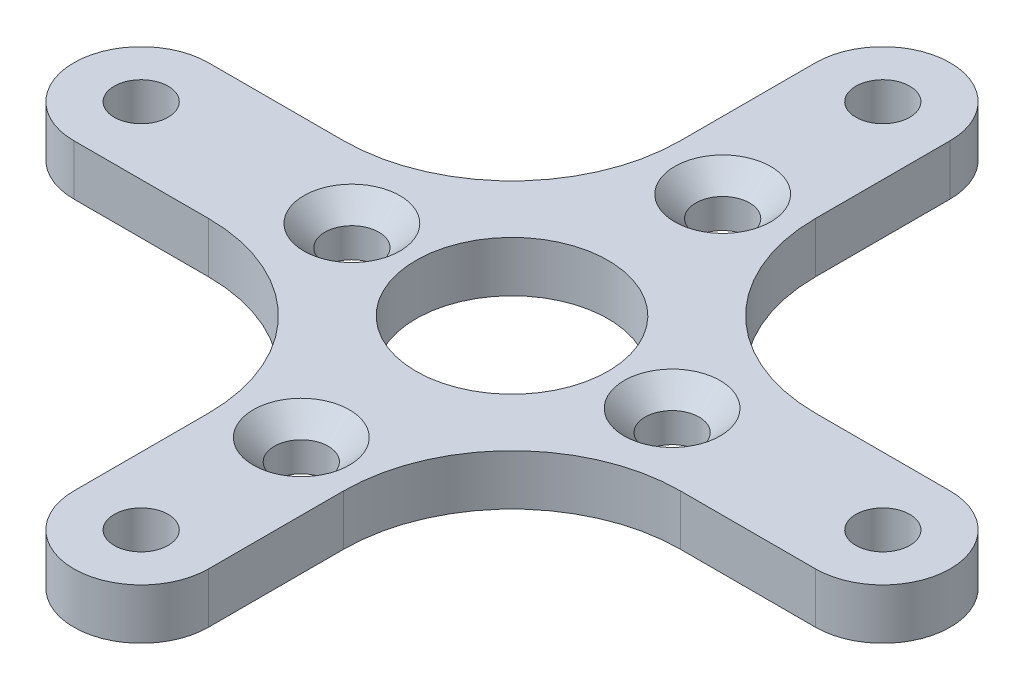
ISO-10303-21;
HEADER;
FILE_DESCRIPTION(('STEP AP214'),'2;1');
FILE_NAME('part.step','',(''),(''),'','','');
FILE_SCHEMA(('AUTOMOTIVE_DESIGN { 1 0 10303 214 1 1 1 1 }'));
ENDSEC;
DATA;
#1=APPLICATION_CONTEXT('core data for automotive mechanical design processes');
#2=APPLICATION_PROTOCOL_DEFINITION('international standard','automotive_design',2000,#1);
#3=PRODUCT_CONTEXT('',#1,'mechanical');
#4=PRODUCT('Part','Part','',(#3));
#5=PRODUCT_RELATED_PRODUCT_CATEGORY('part','',(#4));
#6=PRODUCT_DEFINITION_FORMATION('','',#4);
#7=PRODUCT_DEFINITION_CONTEXT('part definition',#1,'design');
#8=PRODUCT_DEFINITION('design','',#6,#7);
#9=PRODUCT_DEFINITION_SHAPE('','',#8);
#10=(LENGTH_UNIT() NAMED_UNIT(*) SI_UNIT(.MILLI.,.METRE.));
#11=(NAMED_UNIT(*) PLANE_ANGLE_UNIT() SI_UNIT($,.RADIAN.));
#12=(NAMED_UNIT(*) SI_UNIT($,.STERADIAN.) SOLID_ANGLE_UNIT());
#13=UNCERTAINTY_MEASURE_WITH_UNIT(LENGTH_MEASURE(1.E-05),#10,'distance_accuracy_value','');
#14=(GEOMETRIC_REPRESENTATION_CONTEXT(3) GLOBAL_UNCERTAINTY_ASSIGNED_CONTEXT((#13)) GLOBAL_UNIT_ASSIGNED_CONTEXT((#10,
#11,#12)) REPRESENTATION_CONTEXT('',''));
#15=CARTESIAN_POINT('',(0.,0.,0.));
#16=DIRECTION('',(0.,0.,1.));
#17=DIRECTION('',(1.,0.,0.));
#18=AXIS2_PLACEMENT_3D('',#15,#16,#17);
#19=CARTESIAN_POINT('',(4.,3.,0.));
#20=DIRECTION('',(-1.,0.,0.));
#21=DIRECTION('',(0.,0.,1.));
#22=AXIS2_PLACEMENT_3D('',#19,#20,#21);
#23=PLANE('',#22);
#24=DIRECTION('',(0.,0.,-1.));
#25=VECTOR('',#24,1.);
#26=CARTESIAN_POINT('',(4.,3.,0.));
#27=LINE('',#26,#25);
#28=CARTESIAN_POINT('',(4.,3.,-14.));
#29=VERTEX_POINT('',#28);
#30=CARTESIAN_POINT('',(4.,3.,-22.));
#31=VERTEX_POINT('',#30);
#32=EDGE_CURVE('E157',#29,#31,#27,.T.);
#33=ORIENTED_EDGE('',*,*,#32,.F.);
#34=DIRECTION('',(0.,-1.,0.));
#35=VECTOR('',#34,1.);
#36=CARTESIAN_POINT('',(4.,0.,-14.));
#37=LINE('',#36,#35);
#38=CARTESIAN_POINT('',(4.,0.,-14.));
#39=VERTEX_POINT('',#38);
#40=EDGE_CURVE('E356',#29,#39,#37,.T.);
#41=ORIENTED_EDGE('',*,*,#40,.T.);
#42=DIRECTION('',(0.,0.,-1.));
#43=VECTOR('',#42,1.);
#44=CARTESIAN_POINT('',(4.,0.,0.));
#45=LINE('',#44,#43);
#46=CARTESIAN_POINT('',(4.,0.,-22.));
#47=VERTEX_POINT('',#46);
#48=EDGE_CURVE('E175',#39,#47,#45,.T.);
#49=ORIENTED_EDGE('',*,*,#48,.T.);
#50=DIRECTION('',(0.,-1.,0.));
#51=VECTOR('',#50,1.);
#52=CARTESIAN_POINT('',(4.,3.,-22.));
#53=LINE('',#52,#51);
#54=EDGE_CURVE('E173',#31,#47,#53,.T.);
#55=ORIENTED_EDGE('',*,*,#54,.F.);
#56=EDGE_LOOP('',(#33,#41,#49,#55));
#57=FACE_BOUND('',#56,.T.);
#58=ADVANCED_FACE('F43',(#57),#23,.F.);
#59=CARTESIAN_POINT('',(0.,3.,-22.));
#60=DIRECTION('',(0.,-1.,0.));
#61=DIRECTION('',(0.,0.,-1.));
#62=AXIS2_PLACEMENT_3D('',#59,#60,#61);
#63=CYLINDRICAL_SURFACE('',#62,4.00000000000001);
#64=CARTESIAN_POINT('',(0.,0.,-22.));
#65=DIRECTION('',(0.,1.,0.));
#66=DIRECTION('',(0.,0.,1.));
#67=AXIS2_PLACEMENT_3D('',#64,#65,#66);
#68=CIRCLE('',#67,4.00000000000001);
#69=CARTESIAN_POINT('',(-4.00000000000001,0.,-22.));
#70=VERTEX_POINT('',#69);
#71=EDGE_CURVE('E225',#70,#47,#68,.F.);
#72=ORIENTED_EDGE('',*,*,#71,.F.);
#73=DIRECTION('',(0.,-1.,0.));
#74=VECTOR('',#73,1.);
#75=CARTESIAN_POINT('',(-4.00000000000001,3.,-22.));
#76=LINE('',#75,#74);
#77=CARTESIAN_POINT('',(-4.00000000000001,3.,-22.));
#78=VERTEX_POINT('',#77);
#79=EDGE_CURVE('E181',#78,#70,#76,.T.);
#80=ORIENTED_EDGE('',*,*,#79,.F.);
#81=CARTESIAN_POINT('',(0.,3.,-22.));
#82=DIRECTION('',(0.,1.,0.));
#83=DIRECTION('',(0.,0.,1.));
#84=AXIS2_PLACEMENT_3D('',#81,#82,#83);
#85=CIRCLE('',#84,4.00000000000001);
#86=EDGE_CURVE('E163',#78,#31,#85,.F.);
#87=ORIENTED_EDGE('',*,*,#86,.T.);
#88=ORIENTED_EDGE('',*,*,#54,.T.);
#89=EDGE_LOOP('',(#72,#80,#87,#88));
#90=FACE_BOUND('',#89,.T.);
#91=ADVANCED_FACE('F183',(#90),#63,.T.);
#92=CARTESIAN_POINT('',(-4.00000000000001,3.,0.));
#93=DIRECTION('',(1.,0.,0.));
#94=DIRECTION('',(0.,0.,-1.));
#95=AXIS2_PLACEMENT_3D('',#92,#93,#94);
#96=PLANE('',#95);
#97=DIRECTION('',(0.,0.,1.));
#98=VECTOR('',#97,1.);
#99=CARTESIAN_POINT('',(-4.00000000000001,0.,0.));
#100=LINE('',#99,#98);
#101=CARTESIAN_POINT('',(-4.00000000000001,0.,-14.));
#102=VERTEX_POINT('',#101);
#103=EDGE_CURVE('E229',#70,#102,#100,.T.);
#104=ORIENTED_EDGE('',*,*,#103,.T.);
#105=DIRECTION('',(0.,-1.,0.));
#106=VECTOR('',#105,1.);
#107=CARTESIAN_POINT('',(-4.00000000000001,3.,-14.));
#108=LINE('',#107,#106);
#109=CARTESIAN_POINT('',(-4.00000000000001,3.,-14.));
#110=VERTEX_POINT('',#109);
#111=EDGE_CURVE('E353',#102,#110,#108,.F.);
#112=ORIENTED_EDGE('',*,*,#111,.T.);
#113=DIRECTION('',(0.,0.,1.));
#114=VECTOR('',#113,1.);
#115=CARTESIAN_POINT('',(-4.00000000000001,3.,0.));
#116=LINE('',#115,#114);
#117=EDGE_CURVE('E186',#78,#110,#116,.T.);
#118=ORIENTED_EDGE('',*,*,#117,.F.);
#119=ORIENTED_EDGE('',*,*,#79,.T.);
#120=EDGE_LOOP('',(#104,#112,#118,#119));
#121=FACE_BOUND('',#120,.T.);
#122=ADVANCED_FACE('F437',(#121),#96,.F.);
#123=CARTESIAN_POINT('',(0.,3.,-4.));
#124=DIRECTION('',(0.,0.,1.));
#125=DIRECTION('',(1.,0.,0.));
#126=AXIS2_PLACEMENT_3D('',#123,#124,#125);
#127=PLANE('',#126);
#128=DIRECTION('',(-1.,0.,0.));
#129=VECTOR('',#128,1.);
#130=CARTESIAN_POINT('',(0.,3.,-4.));
#131=LINE('',#130,#129);
#132=CARTESIAN_POINT('',(-14.,3.,-4.));
#133=VERTEX_POINT('',#132);
#134=CARTESIAN_POINT('',(-22.,3.,-4.));
#135=VERTEX_POINT('',#134);
#136=EDGE_CURVE('E189',#133,#135,#131,.T.);
#137=ORIENTED_EDGE('',*,*,#136,.F.);
#138=DIRECTION('',(0.,-1.,0.));
#139=VECTOR('',#138,1.);
#140=CARTESIAN_POINT('',(-14.,0.,-4.));
#141=LINE('',#140,#139);
#142=CARTESIAN_POINT('',(-14.,0.,-4.));
#143=VERTEX_POINT('',#142);
#144=EDGE_CURVE('E349',#133,#143,#141,.T.);
#145=ORIENTED_EDGE('',*,*,#144,.T.);
#146=DIRECTION('',(-1.,0.,0.));
#147=VECTOR('',#146,1.);
#148=CARTESIAN_POINT('',(0.,0.,-4.));
#149=LINE('',#148,#147);
#150=CARTESIAN_POINT('',(-22.,0.,-4.));
#151=VERTEX_POINT('',#150);
#152=EDGE_CURVE('E233',#143,#151,#149,.T.);
#153=ORIENTED_EDGE('',*,*,#152,.T.);
#154=DIRECTION('',(0.,-1.,0.));
#155=VECTOR('',#154,1.);
#156=CARTESIAN_POINT('',(-22.,3.,-4.));
#157=LINE('',#156,#155);
#158=EDGE_CURVE('E280',#135,#151,#157,.T.);
#159=ORIENTED_EDGE('',*,*,#158,.F.);
#160=EDGE_LOOP('',(#137,#145,#153,#159));
#161=FACE_BOUND('',#160,.T.);
#162=ADVANCED_FACE('F429',(#161),#127,.F.);
#163=CARTESIAN_POINT('',(-22.,3.,0.));
#164=DIRECTION('',(0.,-1.,0.));
#165=DIRECTION('',(0.,0.,-1.));
#166=AXIS2_PLACEMENT_3D('',#163,#164,#165);
#167=CYLINDRICAL_SURFACE('',#166,4.00000000000001);
#168=CARTESIAN_POINT('',(-22.,0.,0.));
#169=DIRECTION('',(0.,1.,0.));
#170=DIRECTION('',(0.,0.,1.));
#171=AXIS2_PLACEMENT_3D('',#168,#169,#170);
#172=CIRCLE('',#171,4.00000000000001);
#173=CARTESIAN_POINT('',(-22.,0.,4.00000000000001));
#174=VERTEX_POINT('',#173);
#175=EDGE_CURVE('E236',#151,#174,#172,.T.);
#176=ORIENTED_EDGE('',*,*,#175,.T.);
#177=DIRECTION('',(0.,-1.,0.));
#178=VECTOR('',#177,1.);
#179=CARTESIAN_POINT('',(-22.,3.,4.00000000000001));
#180=LINE('',#179,#178);
#181=CARTESIAN_POINT('',(-22.,3.,4.00000000000001));
#182=VERTEX_POINT('',#181);
#183=EDGE_CURVE('E276',#182,#174,#180,.T.);
#184=ORIENTED_EDGE('',*,*,#183,.F.);
#185=CARTESIAN_POINT('',(-22.,3.,0.));
#186=DIRECTION('',(0.,1.,0.));
#187=DIRECTION('',(0.,0.,1.));
#188=AXIS2_PLACEMENT_3D('',#185,#186,#187);
#189=CIRCLE('',#188,4.00000000000001);
#190=EDGE_CURVE('E195',#135,#182,#189,.T.);
#191=ORIENTED_EDGE('',*,*,#190,.F.);
#192=ORIENTED_EDGE('',*,*,#158,.T.);
#193=EDGE_LOOP('',(#176,#184,#191,#192));
#194=FACE_BOUND('',#193,.T.);
#195=ADVANCED_FACE('F425',(#194),#167,.T.);
#196=CARTESIAN_POINT('',(0.,3.,4.));
#197=DIRECTION('',(0.,0.,-1.));
#198=DIRECTION('',(-1.,0.,0.));
#199=AXIS2_PLACEMENT_3D('',#196,#197,#198);
#200=PLANE('',#199);
#201=DIRECTION('',(1.,0.,0.));
#202=VECTOR('',#201,1.);
#203=CARTESIAN_POINT('',(0.,0.,4.));
#204=LINE('',#203,#202);
#205=CARTESIAN_POINT('',(-14.,0.,4.00000000000001));
#206=VERTEX_POINT('',#205);
#207=EDGE_CURVE('E239',#174,#206,#204,.T.);
#208=ORIENTED_EDGE('',*,*,#207,.T.);
#209=DIRECTION('',(0.,-1.,0.));
#210=VECTOR('',#209,1.);
#211=CARTESIAN_POINT('',(-14.,3.,4.00000000000001));
#212=LINE('',#211,#210);
#213=CARTESIAN_POINT('',(-14.,3.,4.00000000000001));
#214=VERTEX_POINT('',#213);
#215=EDGE_CURVE('E59',#206,#214,#212,.F.);
#216=ORIENTED_EDGE('',*,*,#215,.T.);
#217=DIRECTION('',(1.,0.,0.));
#218=VECTOR('',#217,1.);
#219=CARTESIAN_POINT('',(0.,3.,4.));
#220=LINE('',#219,#218);
#221=EDGE_CURVE('E198',#182,#214,#220,.T.);
#222=ORIENTED_EDGE('',*,*,#221,.F.);
#223=ORIENTED_EDGE('',*,*,#183,.T.);
#224=EDGE_LOOP('',(#208,#216,#222,#223));
#225=FACE_BOUND('',#224,.T.);
#226=ADVANCED_FACE('F421',(#225),#200,.F.);
#227=CARTESIAN_POINT('',(-4.00000000000001,3.,0.));
#228=DIRECTION('',(1.,0.,0.));
#229=DIRECTION('',(0.,0.,-1.));
#230=AXIS2_PLACEMENT_3D('',#227,#228,#229);
#231=PLANE('',#230);
#232=DIRECTION('',(0.,0.,1.));
#233=VECTOR('',#232,1.);
#234=CARTESIAN_POINT('',(-4.00000000000001,3.,0.));
#235=LINE('',#234,#233);
#236=CARTESIAN_POINT('',(-4.00000000000001,3.,14.));
#237=VERTEX_POINT('',#236);
#238=CARTESIAN_POINT('',(-4.00000000000001,3.,22.));
#239=VERTEX_POINT('',#238);
#240=EDGE_CURVE('E201',#237,#239,#235,.T.);
#241=ORIENTED_EDGE('',*,*,#240,.F.);
#242=DIRECTION('',(0.,-1.,0.));
#243=VECTOR('',#242,1.);
#244=CARTESIAN_POINT('',(-4.00000000000001,0.,14.));
#245=LINE('',#244,#243);
#246=CARTESIAN_POINT('',(-4.00000000000001,0.,14.));
#247=VERTEX_POINT('',#246);
#248=EDGE_CURVE('E369',#237,#247,#245,.T.);
#249=ORIENTED_EDGE('',*,*,#248,.T.);
#250=DIRECTION('',(0.,0.,1.));
#251=VECTOR('',#250,1.);
#252=CARTESIAN_POINT('',(-4.00000000000001,0.,0.));
#253=LINE('',#252,#251);
#254=CARTESIAN_POINT('',(-4.00000000000001,0.,22.));
#255=VERTEX_POINT('',#254);
#256=EDGE_CURVE('E242',#247,#255,#253,.T.);
#257=ORIENTED_EDGE('',*,*,#256,.T.);
#258=DIRECTION('',(0.,-1.,0.));
#259=VECTOR('',#258,1.);
#260=CARTESIAN_POINT('',(-4.00000000000001,3.,22.));
#261=LINE('',#260,#259);
#262=EDGE_CURVE('E272',#239,#255,#261,.T.);
#263=ORIENTED_EDGE('',*,*,#262,.F.);
#264=EDGE_LOOP('',(#241,#249,#257,#263));
#265=FACE_BOUND('',#264,.T.);
#266=ADVANCED_FACE('F415',(#265),#231,.F.);
#267=CARTESIAN_POINT('',(0.,3.,22.));
#268=DIRECTION('',(0.,-1.,0.));
#269=DIRECTION('',(0.,0.,-1.));
#270=AXIS2_PLACEMENT_3D('',#267,#268,#269);
#271=CYLINDRICAL_SURFACE('',#270,4.00000000000001);
#272=CARTESIAN_POINT('',(0.,0.,22.));
#273=DIRECTION('',(0.,1.,0.));
#274=DIRECTION('',(0.,0.,1.));
#275=AXIS2_PLACEMENT_3D('',#272,#273,#274);
#276=CIRCLE('',#275,4.00000000000001);
#277=CARTESIAN_POINT('',(4.,0.,22.));
#278=VERTEX_POINT('',#277);
#279=EDGE_CURVE('E245',#278,#255,#276,.F.);
#280=ORIENTED_EDGE('',*,*,#279,.F.);
#281=DIRECTION('',(0.,-1.,0.));
#282=VECTOR('',#281,1.);
#283=CARTESIAN_POINT('',(4.,3.,22.));
#284=LINE('',#283,#282);
#285=CARTESIAN_POINT('',(4.,3.,22.));
#286=VERTEX_POINT('',#285);
#287=EDGE_CURVE('E269',#286,#278,#284,.T.);
#288=ORIENTED_EDGE('',*,*,#287,.F.);
#289=CARTESIAN_POINT('',(0.,3.,22.));
#290=DIRECTION('',(0.,1.,0.));
#291=DIRECTION('',(0.,0.,1.));
#292=AXIS2_PLACEMENT_3D('',#289,#290,#291);
#293=CIRCLE('',#292,4.00000000000001);
#294=EDGE_CURVE('E204',#286,#239,#293,.F.);
#295=ORIENTED_EDGE('',*,*,#294,.T.);
#296=ORIENTED_EDGE('',*,*,#262,.T.);
#297=EDGE_LOOP('',(#280,#288,#295,#296));
#298=FACE_BOUND('',#297,.T.);
#299=ADVANCED_FACE('F411',(#298),#271,.T.);
#300=CARTESIAN_POINT('',(4.,3.,0.));
#301=DIRECTION('',(-1.,0.,0.));
#302=DIRECTION('',(0.,0.,1.));
#303=AXIS2_PLACEMENT_3D('',#300,#301,#302);
#304=PLANE('',#303);
#305=DIRECTION('',(0.,0.,-1.));
#306=VECTOR('',#305,1.);
#307=CARTESIAN_POINT('',(4.,0.,0.));
#308=LINE('',#307,#306);
#309=CARTESIAN_POINT('',(4.,0.,14.));
#310=VERTEX_POINT('',#309);
#311=EDGE_CURVE('E249',#278,#310,#308,.T.);
#312=ORIENTED_EDGE('',*,*,#311,.T.);
#313=DIRECTION('',(0.,-1.,0.));
#314=VECTOR('',#313,1.);
#315=CARTESIAN_POINT('',(4.,3.,14.));
#316=LINE('',#315,#314);
#317=CARTESIAN_POINT('',(4.,3.,14.));
#318=VERTEX_POINT('',#317);
#319=EDGE_CURVE('E366',#310,#318,#316,.F.);
#320=ORIENTED_EDGE('',*,*,#319,.T.);
#321=DIRECTION('',(0.,0.,-1.));
#322=VECTOR('',#321,1.);
#323=CARTESIAN_POINT('',(4.,3.,0.));
#324=LINE('',#323,#322);
#325=EDGE_CURVE('E208',#286,#318,#324,.T.);
#326=ORIENTED_EDGE('',*,*,#325,.F.);
#327=ORIENTED_EDGE('',*,*,#287,.T.);
#328=EDGE_LOOP('',(#312,#320,#326,#327));
#329=FACE_BOUND('',#328,.T.);
#330=ADVANCED_FACE('F409',(#329),#304,.F.);
#331=CARTESIAN_POINT('',(0.,3.,4.));
#332=DIRECTION('',(0.,0.,-1.));
#333=DIRECTION('',(-1.,0.,0.));
#334=AXIS2_PLACEMENT_3D('',#331,#332,#333);
#335=PLANE('',#334);
#336=DIRECTION('',(1.,0.,0.));
#337=VECTOR('',#336,1.);
#338=CARTESIAN_POINT('',(0.,3.,4.));
#339=LINE('',#338,#337);
#340=CARTESIAN_POINT('',(14.,3.,4.00000000000001));
#341=VERTEX_POINT('',#340);
#342=CARTESIAN_POINT('',(22.,3.,4.00000000000001));
#343=VERTEX_POINT('',#342);
#344=EDGE_CURVE('E212',#341,#343,#339,.T.);
#345=ORIENTED_EDGE('',*,*,#344,.F.);
#346=DIRECTION('',(0.,-1.,0.));
#347=VECTOR('',#346,1.);
#348=CARTESIAN_POINT('',(14.,0.,4.));
#349=LINE('',#348,#347);
#350=CARTESIAN_POINT('',(14.,0.,4.00000000000001));
#351=VERTEX_POINT('',#350);
#352=EDGE_CURVE('E362',#341,#351,#349,.T.);
#353=ORIENTED_EDGE('',*,*,#352,.T.);
#354=DIRECTION('',(1.,0.,0.));
#355=VECTOR('',#354,1.);
#356=CARTESIAN_POINT('',(0.,0.,4.));
#357=LINE('',#356,#355);
#358=CARTESIAN_POINT('',(22.,0.,4.00000000000001));
#359=VERTEX_POINT('',#358);
#360=EDGE_CURVE('E253',#351,#359,#357,.T.);
#361=ORIENTED_EDGE('',*,*,#360,.T.);
#362=DIRECTION('',(0.,-1.,0.));
#363=VECTOR('',#362,1.);
#364=CARTESIAN_POINT('',(22.,3.,4.00000000000001));
#365=LINE('',#364,#363);
#366=EDGE_CURVE('E265',#343,#359,#365,.T.);
#367=ORIENTED_EDGE('',*,*,#366,.F.);
#368=EDGE_LOOP('',(#345,#353,#361,#367));
#369=FACE_BOUND('',#368,.T.);
#370=ADVANCED_FACE('F402',(#369),#335,.F.);
#371=CARTESIAN_POINT('',(22.,3.,0.));
#372=DIRECTION('',(0.,-1.,0.));
#373=DIRECTION('',(0.,0.,-1.));
#374=AXIS2_PLACEMENT_3D('',#371,#372,#373);
#375=CYLINDRICAL_SURFACE('',#374,4.00000000000001);
#376=CARTESIAN_POINT('',(22.,0.,0.));
#377=DIRECTION('',(0.,1.,0.));
#378=DIRECTION('',(0.,0.,1.));
#379=AXIS2_PLACEMENT_3D('',#376,#377,#378);
#380=CIRCLE('',#379,4.00000000000001);
#381=CARTESIAN_POINT('',(22.,0.,-4.));
#382=VERTEX_POINT('',#381);
#383=EDGE_CURVE('E256',#382,#359,#380,.F.);
#384=ORIENTED_EDGE('',*,*,#383,.F.);
#385=DIRECTION('',(0.,-1.,0.));
#386=VECTOR('',#385,1.);
#387=CARTESIAN_POINT('',(22.,3.,-4.));
#388=LINE('',#387,#386);
#389=CARTESIAN_POINT('',(22.,3.,-4.));
#390=VERTEX_POINT('',#389);
#391=EDGE_CURVE('E222',#390,#382,#388,.T.);
#392=ORIENTED_EDGE('',*,*,#391,.F.);
#393=CARTESIAN_POINT('',(22.,3.,0.));
#394=DIRECTION('',(0.,1.,0.));
#395=DIRECTION('',(0.,0.,1.));
#396=AXIS2_PLACEMENT_3D('',#393,#394,#395);
#397=CIRCLE('',#396,4.00000000000001);
#398=EDGE_CURVE('E215',#390,#343,#397,.F.);
#399=ORIENTED_EDGE('',*,*,#398,.T.);
#400=ORIENTED_EDGE('',*,*,#366,.T.);
#401=EDGE_LOOP('',(#384,#392,#399,#400));
#402=FACE_BOUND('',#401,.T.);
#403=ADVANCED_FACE('F540',(#402),#375,.T.);
#404=CARTESIAN_POINT('',(0.,3.,-4.));
#405=DIRECTION('',(0.,0.,1.));
#406=DIRECTION('',(1.,0.,0.));
#407=AXIS2_PLACEMENT_3D('',#404,#405,#406);
#408=PLANE('',#407);
#409=DIRECTION('',(-1.,0.,0.));
#410=VECTOR('',#409,1.);
#411=CARTESIAN_POINT('',(0.,0.,-4.));
#412=LINE('',#411,#410);
#413=CARTESIAN_POINT('',(14.,0.,-4.));
#414=VERTEX_POINT('',#413);
#415=EDGE_CURVE('E170',#382,#414,#412,.T.);
#416=ORIENTED_EDGE('',*,*,#415,.T.);
#417=DIRECTION('',(0.,-1.,0.));
#418=VECTOR('',#417,1.);
#419=CARTESIAN_POINT('',(14.,3.,-4.));
#420=LINE('',#419,#418);
#421=CARTESIAN_POINT('',(14.,3.,-4.));
#422=VERTEX_POINT('',#421);
#423=EDGE_CURVE('E359',#414,#422,#420,.F.);
#424=ORIENTED_EDGE('',*,*,#423,.T.);
#425=DIRECTION('',(-1.,0.,0.));
#426=VECTOR('',#425,1.);
#427=CARTESIAN_POINT('',(0.,3.,-4.));
#428=LINE('',#427,#426);
#429=EDGE_CURVE('E219',#390,#422,#428,.T.);
#430=ORIENTED_EDGE('',*,*,#429,.F.);
#431=ORIENTED_EDGE('',*,*,#391,.T.);
#432=EDGE_LOOP('',(#416,#424,#430,#431));
#433=FACE_BOUND('',#432,.T.);
#434=ADVANCED_FACE('F533',(#433),#408,.F.);
#435=CARTESIAN_POINT('',(0.,3.,0.));
#436=DIRECTION('',(0.,1.,0.));
#437=DIRECTION('',(0.,0.,1.));
#438=AXIS2_PLACEMENT_3D('',#435,#436,#437);
#439=PLANE('',#438);
#440=CARTESIAN_POINT('',(0.,3.,0.));
#441=DIRECTION('',(0.,1.,0.));
#442=DIRECTION('',(0.,0.,1.));
#443=AXIS2_PLACEMENT_3D('',#440,#441,#442);
#444=CIRCLE('',#443,5.7);
#445=CARTESIAN_POINT('',(0.,3.,5.7));
#446=VERTEX_POINT('',#445);
#447=EDGE_CURVE('E788',#446,#446,#444,.T.);
#448=ORIENTED_EDGE('',*,*,#447,.F.);
#449=EDGE_LOOP('',(#448));
#450=FACE_BOUND('',#449,.T.);
#451=CARTESIAN_POINT('',(0.,3.,12.5));
#452=DIRECTION('',(0.,1.,0.));
#453=DIRECTION('',(0.,0.,1.));
#454=AXIS2_PLACEMENT_3D('',#451,#452,#453);
#455=CIRCLE('',#454,2.85000000000001);
#456=CARTESIAN_POINT('',(0.,3.,15.35));
#457=VERTEX_POINT('',#456);
#458=EDGE_CURVE('E333',#457,#457,#455,.F.);
#459=ORIENTED_EDGE('',*,*,#458,.T.);
#460=EDGE_LOOP('',(#459));
#461=FACE_BOUND('',#460,.T.);
#462=CARTESIAN_POINT('',(9.5,3.,0.));
#463=DIRECTION('',(0.,1.,0.));
#464=DIRECTION('',(0.,0.,1.));
#465=AXIS2_PLACEMENT_3D('',#462,#463,#464);
#466=CIRCLE('',#465,2.85000000000001);
#467=CARTESIAN_POINT('',(9.5,3.,2.85000000000001));
#468=VERTEX_POINT('',#467);
#469=EDGE_CURVE('E329',#468,#468,#466,.F.);
#470=ORIENTED_EDGE('',*,*,#469,.T.);
#471=EDGE_LOOP('',(#470));
#472=FACE_BOUND('',#471,.T.);
#473=CARTESIAN_POINT('',(0.,3.,-12.5));
#474=DIRECTION('',(0.,1.,0.));
#475=DIRECTION('',(0.,0.,1.));
#476=AXIS2_PLACEMENT_3D('',#473,#474,#475);
#477=CIRCLE('',#476,2.85000000000001);
#478=CARTESIAN_POINT('',(0.,3.,-9.64999999999999));
#479=VERTEX_POINT('',#478);
#480=EDGE_CURVE('E325',#479,#479,#477,.F.);
#481=ORIENTED_EDGE('',*,*,#480,.T.);
#482=EDGE_LOOP('',(#481));
#483=FACE_BOUND('',#482,.T.);
#484=CARTESIAN_POINT('',(-9.5,3.,0.));
#485=DIRECTION('',(0.,1.,0.));
#486=DIRECTION('',(0.,0.,1.));
#487=AXIS2_PLACEMENT_3D('',#484,#485,#486);
#488=CIRCLE('',#487,2.85000000000001);
#489=CARTESIAN_POINT('',(-9.5,3.,2.85000000000001));
#490=VERTEX_POINT('',#489);
#491=EDGE_CURVE('E321',#490,#490,#488,.F.);
#492=ORIENTED_EDGE('',*,*,#491,.T.);
#493=EDGE_LOOP('',(#492));
#494=FACE_BOUND('',#493,.T.);
#495=CARTESIAN_POINT('',(-22.,3.,0.));
#496=DIRECTION('',(0.,1.,0.));
#497=DIRECTION('',(0.,0.,1.));
#498=AXIS2_PLACEMENT_3D('',#495,#496,#497);
#499=CIRCLE('',#498,1.6);
#500=CARTESIAN_POINT('',(-22.,3.,1.6));
#501=VERTEX_POINT('',#500);
#502=EDGE_CURVE('E291',#501,#501,#499,.T.);
#503=ORIENTED_EDGE('',*,*,#502,.F.);
#504=EDGE_LOOP('',(#503));
#505=FACE_BOUND('',#504,.T.);
#506=CARTESIAN_POINT('',(0.,3.,-22.));
#507=DIRECTION('',(0.,1.,0.));
#508=DIRECTION('',(0.,0.,1.));
#509=AXIS2_PLACEMENT_3D('',#506,#507,#508);
#510=CIRCLE('',#509,1.6);
#511=CARTESIAN_POINT('',(0.,3.,-20.4));
#512=VERTEX_POINT('',#511);
#513=EDGE_CURVE('E800',#512,#512,#510,.T.);
#514=ORIENTED_EDGE('',*,*,#513,.F.);
#515=EDGE_LOOP('',(#514));
#516=FACE_BOUND('',#515,.T.);
#517=CARTESIAN_POINT('',(0.,3.,22.));
#518=DIRECTION('',(0.,1.,0.));
#519=DIRECTION('',(0.,0.,1.));
#520=AXIS2_PLACEMENT_3D('',#517,#518,#519);
#521=CIRCLE('',#520,1.6);
#522=CARTESIAN_POINT('',(0.,3.,23.6));
#523=VERTEX_POINT('',#522);
#524=EDGE_CURVE('E793',#523,#523,#521,.T.);
#525=ORIENTED_EDGE('',*,*,#524,.F.);
#526=EDGE_LOOP('',(#525));
#527=FACE_BOUND('',#526,.T.);
#528=CARTESIAN_POINT('',(22.,3.,0.));
#529=DIRECTION('',(0.,1.,0.));
#530=DIRECTION('',(0.,0.,1.));
#531=AXIS2_PLACEMENT_3D('',#528,#529,#530);
#532=CIRCLE('',#531,1.6);
#533=CARTESIAN_POINT('',(22.,3.,1.6));
#534=VERTEX_POINT('',#533);
#535=EDGE_CURVE('E787',#534,#534,#532,.T.);
#536=ORIENTED_EDGE('',*,*,#535,.F.);
#537=EDGE_LOOP('',(#536));
#538=FACE_BOUND('',#537,.T.);
#539=ORIENTED_EDGE('',*,*,#429,.T.);
#540=CARTESIAN_POINT('',(14.,3.,-14.));
#541=DIRECTION('',(0.,1.,0.));
#542=DIRECTION('',(0.,0.,1.));
#543=AXIS2_PLACEMENT_3D('',#540,#541,#542);
#544=CIRCLE('',#543,10.);
#545=EDGE_CURVE('E165',#422,#29,#544,.F.);
#546=ORIENTED_EDGE('',*,*,#545,.T.);
#547=ORIENTED_EDGE('',*,*,#32,.T.);
#548=ORIENTED_EDGE('',*,*,#86,.F.);
#549=ORIENTED_EDGE('',*,*,#117,.T.);
#550=CARTESIAN_POINT('',(-14.,3.,-14.));
#551=DIRECTION('',(0.,1.,0.));
#552=DIRECTION('',(0.,0.,1.));
#553=AXIS2_PLACEMENT_3D('',#550,#551,#552);
#554=CIRCLE('',#553,10.);
#555=EDGE_CURVE('E378',#110,#133,#554,.F.);
#556=ORIENTED_EDGE('',*,*,#555,.T.);
#557=ORIENTED_EDGE('',*,*,#136,.T.);
#558=ORIENTED_EDGE('',*,*,#190,.T.);
#559=ORIENTED_EDGE('',*,*,#221,.T.);
#560=CARTESIAN_POINT('',(-14.,3.,14.));
#561=DIRECTION('',(0.,1.,0.));
#562=DIRECTION('',(0.,0.,1.));
#563=AXIS2_PLACEMENT_3D('',#560,#561,#562);
#564=CIRCLE('',#563,10.);
#565=EDGE_CURVE('E11',#214,#237,#564,.F.);
#566=ORIENTED_EDGE('',*,*,#565,.T.);
#567=ORIENTED_EDGE('',*,*,#240,.T.);
#568=ORIENTED_EDGE('',*,*,#294,.F.);
#569=ORIENTED_EDGE('',*,*,#325,.T.);
#570=CARTESIAN_POINT('',(14.,3.,14.));
#571=DIRECTION('',(0.,1.,0.));
#572=DIRECTION('',(0.,0.,1.));
#573=AXIS2_PLACEMENT_3D('',#570,#571,#572);
#574=CIRCLE('',#573,10.);
#575=EDGE_CURVE('E389',#318,#341,#574,.F.);
#576=ORIENTED_EDGE('',*,*,#575,.T.);
#577=ORIENTED_EDGE('',*,*,#344,.T.);
#578=ORIENTED_EDGE('',*,*,#398,.F.);
#579=EDGE_LOOP('',(#539,#546,#547,#548,#549,#556,#557,#558,#559,#566,#567,#568,#569,#576,#577,#578));
#580=FACE_BOUND('',#579,.T.);
#581=ADVANCED_FACE('F160',(#450,#461,#472,#483,#494,#505,#516,#527,#538,#580),#439,.T.);
#582=CARTESIAN_POINT('',(0.,0.,0.));
#583=DIRECTION('',(0.,1.,0.));
#584=DIRECTION('',(0.,0.,1.));
#585=AXIS2_PLACEMENT_3D('',#582,#583,#584);
#586=PLANE('',#585);
#587=CARTESIAN_POINT('',(0.,0.,0.));
#588=DIRECTION('',(0.,1.,0.));
#589=DIRECTION('',(0.,0.,1.));
#590=AXIS2_PLACEMENT_3D('',#587,#588,#589);
#591=CIRCLE('',#590,5.7);
#592=CARTESIAN_POINT('',(0.,0.,5.7));
#593=VERTEX_POINT('',#592);
#594=EDGE_CURVE('E762',#593,#593,#591,.T.);
#595=ORIENTED_EDGE('',*,*,#594,.T.);
#596=EDGE_LOOP('',(#595));
#597=FACE_BOUND('',#596,.T.);
#598=CARTESIAN_POINT('',(-22.,0.,0.));
#599=DIRECTION('',(0.,1.,0.));
#600=DIRECTION('',(0.,0.,1.));
#601=AXIS2_PLACEMENT_3D('',#598,#599,#600);
#602=CIRCLE('',#601,1.6);
#603=CARTESIAN_POINT('',(-22.,0.,1.6));
#604=VERTEX_POINT('',#603);
#605=EDGE_CURVE('E226',#604,#604,#602,.T.);
#606=ORIENTED_EDGE('',*,*,#605,.T.);
#607=EDGE_LOOP('',(#606));
#608=FACE_BOUND('',#607,.T.);
#609=CARTESIAN_POINT('',(9.5,0.,0.));
#610=DIRECTION('',(0.,1.,0.));
#611=DIRECTION('',(0.,0.,1.));
#612=AXIS2_PLACEMENT_3D('',#609,#610,#611);
#613=CIRCLE('',#612,1.6);
#614=CARTESIAN_POINT('',(9.5,0.,1.6));
#615=VERTEX_POINT('',#614);
#616=EDGE_CURVE('E311',#615,#615,#613,.T.);
#617=ORIENTED_EDGE('',*,*,#616,.T.);
#618=EDGE_LOOP('',(#617));
#619=FACE_BOUND('',#618,.T.);
#620=CARTESIAN_POINT('',(0.,0.,12.5));
#621=DIRECTION('',(0.,1.,0.));
#622=DIRECTION('',(0.,0.,1.));
#623=AXIS2_PLACEMENT_3D('',#620,#621,#622);
#624=CIRCLE('',#623,1.6);
#625=CARTESIAN_POINT('',(0.,0.,14.1));
#626=VERTEX_POINT('',#625);
#627=EDGE_CURVE('E307',#626,#626,#624,.T.);
#628=ORIENTED_EDGE('',*,*,#627,.T.);
#629=EDGE_LOOP('',(#628));
#630=FACE_BOUND('',#629,.T.);
#631=CARTESIAN_POINT('',(-9.5,0.,0.));
#632=DIRECTION('',(0.,1.,0.));
#633=DIRECTION('',(0.,0.,1.));
#634=AXIS2_PLACEMENT_3D('',#631,#632,#633);
#635=CIRCLE('',#634,1.6);
#636=CARTESIAN_POINT('',(-9.5,0.,1.6));
#637=VERTEX_POINT('',#636);
#638=EDGE_CURVE('E303',#637,#637,#635,.T.);
#639=ORIENTED_EDGE('',*,*,#638,.T.);
#640=EDGE_LOOP('',(#639));
#641=FACE_BOUND('',#640,.T.);
#642=CARTESIAN_POINT('',(0.,0.,-22.));
#643=DIRECTION('',(0.,1.,0.));
#644=DIRECTION('',(0.,0.,1.));
#645=AXIS2_PLACEMENT_3D('',#642,#643,#644);
#646=CIRCLE('',#645,1.6);
#647=CARTESIAN_POINT('',(0.,0.,-20.4));
#648=VERTEX_POINT('',#647);
#649=EDGE_CURVE('E299',#648,#648,#646,.T.);
#650=ORIENTED_EDGE('',*,*,#649,.T.);
#651=EDGE_LOOP('',(#650));
#652=FACE_BOUND('',#651,.T.);
#653=CARTESIAN_POINT('',(0.,0.,22.));
#654=DIRECTION('',(0.,1.,0.));
#655=DIRECTION('',(0.,0.,1.));
#656=AXIS2_PLACEMENT_3D('',#653,#654,#655);
#657=CIRCLE('',#656,1.6);
#658=CARTESIAN_POINT('',(0.,0.,23.6));
#659=VERTEX_POINT('',#658);
#660=EDGE_CURVE('E295',#659,#659,#657,.T.);
#661=ORIENTED_EDGE('',*,*,#660,.T.);
#662=EDGE_LOOP('',(#661));
#663=FACE_BOUND('',#662,.T.);
#664=CARTESIAN_POINT('',(22.,0.,0.));
#665=DIRECTION('',(0.,1.,0.));
#666=DIRECTION('',(0.,0.,1.));
#667=AXIS2_PLACEMENT_3D('',#664,#665,#666);
#668=CIRCLE('',#667,1.6);
#669=CARTESIAN_POINT('',(22.,0.,1.6));
#670=VERTEX_POINT('',#669);
#671=EDGE_CURVE('E290',#670,#670,#668,.T.);
#672=ORIENTED_EDGE('',*,*,#671,.T.);
#673=EDGE_LOOP('',(#672));
#674=FACE_BOUND('',#673,.T.);
#675=CARTESIAN_POINT('',(0.,0.,-12.5));
#676=DIRECTION('',(0.,1.,0.));
#677=DIRECTION('',(0.,0.,1.));
#678=AXIS2_PLACEMENT_3D('',#675,#676,#677);
#679=CIRCLE('',#678,1.6);
#680=CARTESIAN_POINT('',(0.,0.,-10.9));
#681=VERTEX_POINT('',#680);
#682=EDGE_CURVE('E286',#681,#681,#679,.T.);
#683=ORIENTED_EDGE('',*,*,#682,.T.);
#684=EDGE_LOOP('',(#683));
#685=FACE_BOUND('',#684,.T.);
#686=ORIENTED_EDGE('',*,*,#48,.F.);
#687=CARTESIAN_POINT('',(14.,0.,-14.));
#688=DIRECTION('',(0.,1.,0.));
#689=DIRECTION('',(0.,0.,1.));
#690=AXIS2_PLACEMENT_3D('',#687,#688,#689);
#691=CIRCLE('',#690,10.);
#692=EDGE_CURVE('E381',#39,#414,#691,.T.);
#693=ORIENTED_EDGE('',*,*,#692,.T.);
#694=ORIENTED_EDGE('',*,*,#415,.F.);
#695=ORIENTED_EDGE('',*,*,#383,.T.);
#696=ORIENTED_EDGE('',*,*,#360,.F.);
#697=CARTESIAN_POINT('',(14.,0.,14.));
#698=DIRECTION('',(0.,1.,0.));
#699=DIRECTION('',(0.,0.,1.));
#700=AXIS2_PLACEMENT_3D('',#697,#698,#699);
#701=CIRCLE('',#700,10.);
#702=EDGE_CURVE('E386',#351,#310,#701,.T.);
#703=ORIENTED_EDGE('',*,*,#702,.T.);
#704=ORIENTED_EDGE('',*,*,#311,.F.);
#705=ORIENTED_EDGE('',*,*,#279,.T.);
#706=ORIENTED_EDGE('',*,*,#256,.F.);
#707=CARTESIAN_POINT('',(-14.,0.,14.));
#708=DIRECTION('',(0.,1.,0.));
#709=DIRECTION('',(0.,0.,1.));
#710=AXIS2_PLACEMENT_3D('',#707,#708,#709);
#711=CIRCLE('',#710,10.);
#712=EDGE_CURVE('E52',#247,#206,#711,.T.);
#713=ORIENTED_EDGE('',*,*,#712,.T.);
#714=ORIENTED_EDGE('',*,*,#207,.F.);
#715=ORIENTED_EDGE('',*,*,#175,.F.);
#716=ORIENTED_EDGE('',*,*,#152,.F.);
#717=CARTESIAN_POINT('',(-14.,0.,-14.));
#718=DIRECTION('',(0.,1.,0.));
#719=DIRECTION('',(0.,0.,1.));
#720=AXIS2_PLACEMENT_3D('',#717,#718,#719);
#721=CIRCLE('',#720,10.);
#722=EDGE_CURVE('E375',#143,#102,#721,.T.);
#723=ORIENTED_EDGE('',*,*,#722,.T.);
#724=ORIENTED_EDGE('',*,*,#103,.F.);
#725=ORIENTED_EDGE('',*,*,#71,.T.);
#726=EDGE_LOOP('',(#686,#693,#694,#695,#696,#703,#704,#705,#706,#713,#714,#715,#716,#723,#724,#725));
#727=FACE_BOUND('',#726,.T.);
#728=ADVANCED_FACE('F406',(#597,#608,#619,#630,#641,#652,#663,#674,#685,#727),#586,.F.);
#729=CARTESIAN_POINT('',(0.,-22.,-12.5));
#730=DIRECTION('',(0.,1.,0.));
#731=DIRECTION('',(0.,0.,1.));
#732=AXIS2_PLACEMENT_3D('',#729,#730,#731);
#733=CYLINDRICAL_SURFACE('',#732,1.6);
#734=CARTESIAN_POINT('',(0.,1.74999999999999,-12.5));
#735=DIRECTION('',(0.,1.,0.));
#736=DIRECTION('',(0.,0.,1.));
#737=AXIS2_PLACEMENT_3D('',#734,#735,#736);
#738=CIRCLE('',#737,1.6);
#739=CARTESIAN_POINT('',(0.,1.74999999999999,-10.9));
#740=VERTEX_POINT('',#739);
#741=EDGE_CURVE('E341',#740,#740,#738,.T.);
#742=ORIENTED_EDGE('',*,*,#741,.T.);
#743=EDGE_LOOP('',(#742));
#744=FACE_BOUND('',#743,.T.);
#745=ORIENTED_EDGE('',*,*,#682,.F.);
#746=EDGE_LOOP('',(#745));
#747=FACE_BOUND('',#746,.T.);
#748=ADVANCED_FACE('F520',(#744,#747),#733,.F.);
#749=CARTESIAN_POINT('',(22.,-22.,0.));
#750=DIRECTION('',(0.,1.,0.));
#751=DIRECTION('',(0.,0.,1.));
#752=AXIS2_PLACEMENT_3D('',#749,#750,#751);
#753=CYLINDRICAL_SURFACE('',#752,1.6);
#754=ORIENTED_EDGE('',*,*,#535,.T.);
#755=EDGE_LOOP('',(#754));
#756=FACE_BOUND('',#755,.T.);
#757=ORIENTED_EDGE('',*,*,#671,.F.);
#758=EDGE_LOOP('',(#757));
#759=FACE_BOUND('',#758,.T.);
#760=ADVANCED_FACE('F516',(#756,#759),#753,.F.);
#761=CARTESIAN_POINT('',(0.,-22.,22.));
#762=DIRECTION('',(0.,1.,0.));
#763=DIRECTION('',(0.,0.,1.));
#764=AXIS2_PLACEMENT_3D('',#761,#762,#763);
#765=CYLINDRICAL_SURFACE('',#764,1.6);
#766=ORIENTED_EDGE('',*,*,#524,.T.);
#767=EDGE_LOOP('',(#766));
#768=FACE_BOUND('',#767,.T.);
#769=ORIENTED_EDGE('',*,*,#660,.F.);
#770=EDGE_LOOP('',(#769));
#771=FACE_BOUND('',#770,.T.);
#772=ADVANCED_FACE('F519',(#768,#771),#765,.F.);
#773=CARTESIAN_POINT('',(0.,-22.,-22.));
#774=DIRECTION('',(0.,1.,0.));
#775=DIRECTION('',(0.,0.,1.));
#776=AXIS2_PLACEMENT_3D('',#773,#774,#775);
#777=CYLINDRICAL_SURFACE('',#776,1.6);
#778=ORIENTED_EDGE('',*,*,#513,.T.);
#779=EDGE_LOOP('',(#778));
#780=FACE_BOUND('',#779,.T.);
#781=ORIENTED_EDGE('',*,*,#649,.F.);
#782=EDGE_LOOP('',(#781));
#783=FACE_BOUND('',#782,.T.);
#784=ADVANCED_FACE('F508',(#780,#783),#777,.F.);
#785=CARTESIAN_POINT('',(-9.5,-22.,0.));
#786=DIRECTION('',(0.,1.,0.));
#787=DIRECTION('',(0.,0.,1.));
#788=AXIS2_PLACEMENT_3D('',#785,#786,#787);
#789=CYLINDRICAL_SURFACE('',#788,1.6);
#790=CARTESIAN_POINT('',(-9.5,1.74999999999999,0.));
#791=DIRECTION('',(0.,1.,0.));
#792=DIRECTION('',(0.,0.,1.));
#793=AXIS2_PLACEMENT_3D('',#790,#791,#792);
#794=CIRCLE('',#793,1.6);
#795=CARTESIAN_POINT('',(-9.5,1.74999999999999,1.6));
#796=VERTEX_POINT('',#795);
#797=EDGE_CURVE('E345',#796,#796,#794,.T.);
#798=ORIENTED_EDGE('',*,*,#797,.T.);
#799=EDGE_LOOP('',(#798));
#800=FACE_BOUND('',#799,.T.);
#801=ORIENTED_EDGE('',*,*,#638,.F.);
#802=EDGE_LOOP('',(#801));
#803=FACE_BOUND('',#802,.T.);
#804=ADVANCED_FACE('F504',(#800,#803),#789,.F.);
#805=CARTESIAN_POINT('',(0.,-22.,12.5));
#806=DIRECTION('',(0.,1.,0.));
#807=DIRECTION('',(0.,0.,1.));
#808=AXIS2_PLACEMENT_3D('',#805,#806,#807);
#809=CYLINDRICAL_SURFACE('',#808,1.6);
#810=CARTESIAN_POINT('',(0.,1.74999999999999,12.5));
#811=DIRECTION('',(0.,1.,0.));
#812=DIRECTION('',(0.,0.,1.));
#813=AXIS2_PLACEMENT_3D('',#810,#811,#812);
#814=CIRCLE('',#813,1.6);
#815=CARTESIAN_POINT('',(0.,1.74999999999999,14.1));
#816=VERTEX_POINT('',#815);
#817=EDGE_CURVE('E180',#816,#816,#814,.T.);
#818=ORIENTED_EDGE('',*,*,#817,.T.);
#819=EDGE_LOOP('',(#818));
#820=FACE_BOUND('',#819,.T.);
#821=ORIENTED_EDGE('',*,*,#627,.F.);
#822=EDGE_LOOP('',(#821));
#823=FACE_BOUND('',#822,.T.);
#824=ADVANCED_FACE('F507',(#820,#823),#809,.F.);
#825=CARTESIAN_POINT('',(9.5,-22.,0.));
#826=DIRECTION('',(0.,1.,0.));
#827=DIRECTION('',(0.,0.,1.));
#828=AXIS2_PLACEMENT_3D('',#825,#826,#827);
#829=CYLINDRICAL_SURFACE('',#828,1.6);
#830=CARTESIAN_POINT('',(9.5,1.74999999999999,0.));
#831=DIRECTION('',(0.,1.,0.));
#832=DIRECTION('',(0.,0.,1.));
#833=AXIS2_PLACEMENT_3D('',#830,#831,#832);
#834=CIRCLE('',#833,1.6);
#835=CARTESIAN_POINT('',(9.5,1.74999999999999,1.6));
#836=VERTEX_POINT('',#835);
#837=EDGE_CURVE('E337',#836,#836,#834,.T.);
#838=ORIENTED_EDGE('',*,*,#837,.T.);
#839=EDGE_LOOP('',(#838));
#840=FACE_BOUND('',#839,.T.);
#841=ORIENTED_EDGE('',*,*,#616,.F.);
#842=EDGE_LOOP('',(#841));
#843=FACE_BOUND('',#842,.T.);
#844=ADVANCED_FACE('F502',(#840,#843),#829,.F.);
#845=CARTESIAN_POINT('',(-22.,-22.,0.));
#846=DIRECTION('',(0.,1.,0.));
#847=DIRECTION('',(0.,0.,1.));
#848=AXIS2_PLACEMENT_3D('',#845,#846,#847);
#849=CYLINDRICAL_SURFACE('',#848,1.6);
#850=ORIENTED_EDGE('',*,*,#502,.T.);
#851=EDGE_LOOP('',(#850));
#852=FACE_BOUND('',#851,.T.);
#853=ORIENTED_EDGE('',*,*,#605,.F.);
#854=EDGE_LOOP('',(#853));
#855=FACE_BOUND('',#854,.T.);
#856=ADVANCED_FACE('F459',(#852,#855),#849,.F.);
#857=CARTESIAN_POINT('',(0.,1.74999999999999,12.5));
#858=DIRECTION('',(0.,1.,0.));
#859=DIRECTION('',(0.,0.,1.));
#860=AXIS2_PLACEMENT_3D('',#857,#858,#859);
#861=CONICAL_SURFACE('',#860,1.6,0.78539816339745);
#862=ORIENTED_EDGE('',*,*,#458,.F.);
#863=EDGE_LOOP('',(#862));
#864=FACE_BOUND('',#863,.T.);
#865=ORIENTED_EDGE('',*,*,#817,.F.);
#866=EDGE_LOOP('',(#865));
#867=FACE_BOUND('',#866,.T.);
#868=ADVANCED_FACE('F452',(#864,#867),#861,.F.);
#869=CARTESIAN_POINT('',(9.5,1.74999999999999,0.));
#870=DIRECTION('',(0.,1.,0.));
#871=DIRECTION('',(0.,0.,1.));
#872=AXIS2_PLACEMENT_3D('',#869,#870,#871);
#873=CONICAL_SURFACE('',#872,1.6,0.78539816339745);
#874=ORIENTED_EDGE('',*,*,#469,.F.);
#875=EDGE_LOOP('',(#874));
#876=FACE_BOUND('',#875,.T.);
#877=ORIENTED_EDGE('',*,*,#837,.F.);
#878=EDGE_LOOP('',(#877));
#879=FACE_BOUND('',#878,.T.);
#880=ADVANCED_FACE('F458',(#876,#879),#873,.F.);
#881=CARTESIAN_POINT('',(0.,1.74999999999999,-12.5));
#882=DIRECTION('',(0.,1.,0.));
#883=DIRECTION('',(0.,0.,1.));
#884=AXIS2_PLACEMENT_3D('',#881,#882,#883);
#885=CONICAL_SURFACE('',#884,1.6,0.78539816339745);
#886=ORIENTED_EDGE('',*,*,#480,.F.);
#887=EDGE_LOOP('',(#886));
#888=FACE_BOUND('',#887,.T.);
#889=ORIENTED_EDGE('',*,*,#741,.F.);
#890=EDGE_LOOP('',(#889));
#891=FACE_BOUND('',#890,.T.);
#892=ADVANCED_FACE('F466',(#888,#891),#885,.F.);
#893=CARTESIAN_POINT('',(-9.5,1.74999999999999,0.));
#894=DIRECTION('',(0.,1.,0.));
#895=DIRECTION('',(0.,0.,1.));
#896=AXIS2_PLACEMENT_3D('',#893,#894,#895);
#897=CONICAL_SURFACE('',#896,1.6,0.78539816339745);
#898=ORIENTED_EDGE('',*,*,#491,.F.);
#899=EDGE_LOOP('',(#898));
#900=FACE_BOUND('',#899,.T.);
#901=ORIENTED_EDGE('',*,*,#797,.F.);
#902=EDGE_LOOP('',(#901));
#903=FACE_BOUND('',#902,.T.);
#904=ADVANCED_FACE('F473',(#900,#903),#897,.F.);
#905=CARTESIAN_POINT('',(-14.,3.,-14.));
#906=DIRECTION('',(0.,1.,0.));
#907=DIRECTION('',(0.,0.,1.));
#908=AXIS2_PLACEMENT_3D('',#905,#906,#907);
#909=CYLINDRICAL_SURFACE('',#908,10.);
#910=ORIENTED_EDGE('',*,*,#555,.F.);
#911=ORIENTED_EDGE('',*,*,#111,.F.);
#912=ORIENTED_EDGE('',*,*,#722,.F.);
#913=ORIENTED_EDGE('',*,*,#144,.F.);
#914=EDGE_LOOP('',(#910,#911,#912,#913));
#915=FACE_BOUND('',#914,.T.);
#916=ADVANCED_FACE('F433',(#915),#909,.F.);
#917=CARTESIAN_POINT('',(14.,3.,-14.));
#918=DIRECTION('',(0.,1.,0.));
#919=DIRECTION('',(0.,0.,1.));
#920=AXIS2_PLACEMENT_3D('',#917,#918,#919);
#921=CYLINDRICAL_SURFACE('',#920,10.);
#922=ORIENTED_EDGE('',*,*,#545,.F.);
#923=ORIENTED_EDGE('',*,*,#423,.F.);
#924=ORIENTED_EDGE('',*,*,#692,.F.);
#925=ORIENTED_EDGE('',*,*,#40,.F.);
#926=EDGE_LOOP('',(#922,#923,#924,#925));
#927=FACE_BOUND('',#926,.T.);
#928=ADVANCED_FACE('F482',(#927),#921,.F.);
#929=CARTESIAN_POINT('',(14.,3.,14.));
#930=DIRECTION('',(0.,1.,0.));
#931=DIRECTION('',(0.,0.,1.));
#932=AXIS2_PLACEMENT_3D('',#929,#930,#931);
#933=CYLINDRICAL_SURFACE('',#932,10.);
#934=ORIENTED_EDGE('',*,*,#575,.F.);
#935=ORIENTED_EDGE('',*,*,#319,.F.);
#936=ORIENTED_EDGE('',*,*,#702,.F.);
#937=ORIENTED_EDGE('',*,*,#352,.F.);
#938=EDGE_LOOP('',(#934,#935,#936,#937));
#939=FACE_BOUND('',#938,.T.);
#940=ADVANCED_FACE('F404',(#939),#933,.F.);
#941=CARTESIAN_POINT('',(-14.,3.,14.));
#942=DIRECTION('',(0.,1.,0.));
#943=DIRECTION('',(0.,0.,1.));
#944=AXIS2_PLACEMENT_3D('',#941,#942,#943);
#945=CYLINDRICAL_SURFACE('',#944,10.);
#946=ORIENTED_EDGE('',*,*,#565,.F.);
#947=ORIENTED_EDGE('',*,*,#215,.F.);
#948=ORIENTED_EDGE('',*,*,#712,.F.);
#949=ORIENTED_EDGE('',*,*,#248,.F.);
#950=EDGE_LOOP('',(#946,#947,#948,#949));
#951=FACE_BOUND('',#950,.T.);
#952=ADVANCED_FACE('F45',(#951),#945,.F.);
#953=CARTESIAN_POINT('',(0.,0.,0.));
#954=DIRECTION('',(0.,1.,0.));
#955=DIRECTION('',(0.,0.,1.));
#956=AXIS2_PLACEMENT_3D('',#953,#954,#955);
#957=CYLINDRICAL_SURFACE('',#956,5.7);
#958=ORIENTED_EDGE('',*,*,#594,.F.);
#959=EDGE_LOOP('',(#958));
#960=FACE_BOUND('',#959,.T.);
#961=ORIENTED_EDGE('',*,*,#447,.T.);
#962=EDGE_LOOP('',(#961));
#963=FACE_BOUND('',#962,.T.);
#964=ADVANCED_FACE('F489',(#960,#963),#957,.F.);
#965=CLOSED_SHELL('',(#58,#91,#122,#162,#195,#226,#266,#299,#330,#370,#403,#434,#581,#728,#748,
#760,#772,#784,#804,#824,#844,#856,#868,#880,#892,#904,#916,#928,#940,#952,#964));
#966=MANIFOLD_SOLID_BREP('B2',#965);
#967=ADVANCED_BREP_SHAPE_REPRESENTATION('',(#18,#966),#14);
#968=SHAPE_DEFINITION_REPRESENTATION(#9,#967);
ENDSEC;
END-ISO-10303-21;
